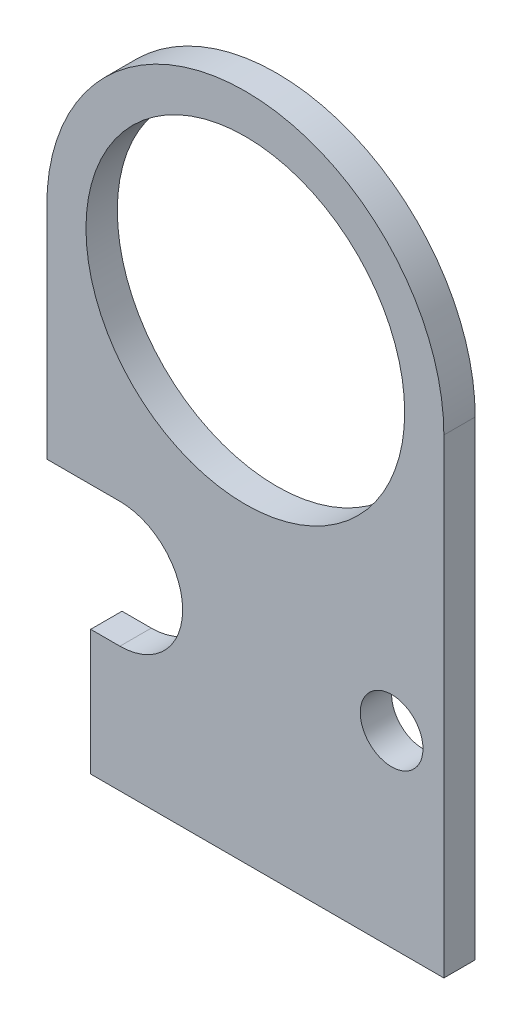
ISO-10303-21;
HEADER;
FILE_DESCRIPTION(('STEP AP214'),'2;1');
FILE_NAME('part.step','',(''),(''),'','','');
FILE_SCHEMA(('AUTOMOTIVE_DESIGN { 1 0 10303 214 1 1 1 1 }'));
ENDSEC;
DATA;
#1=APPLICATION_CONTEXT('core data for automotive mechanical design processes');
#2=APPLICATION_PROTOCOL_DEFINITION('international standard','automotive_design',2000,#1);
#3=PRODUCT_CONTEXT('',#1,'mechanical');
#4=PRODUCT('Part','Part','',(#3));
#5=PRODUCT_RELATED_PRODUCT_CATEGORY('part','',(#4));
#6=PRODUCT_DEFINITION_FORMATION('','',#4);
#7=PRODUCT_DEFINITION_CONTEXT('part definition',#1,'design');
#8=PRODUCT_DEFINITION('design','',#6,#7);
#9=PRODUCT_DEFINITION_SHAPE('','',#8);
#10=(LENGTH_UNIT() NAMED_UNIT(*) SI_UNIT(.MILLI.,.METRE.));
#11=(NAMED_UNIT(*) PLANE_ANGLE_UNIT() SI_UNIT($,.RADIAN.));
#12=(NAMED_UNIT(*) SI_UNIT($,.STERADIAN.) SOLID_ANGLE_UNIT());
#13=UNCERTAINTY_MEASURE_WITH_UNIT(LENGTH_MEASURE(1.E-05),#10,'distance_accuracy_value','');
#14=(GEOMETRIC_REPRESENTATION_CONTEXT(3) GLOBAL_UNCERTAINTY_ASSIGNED_CONTEXT((#13)) GLOBAL_UNIT_ASSIGNED_CONTEXT((#10,
#11,#12)) REPRESENTATION_CONTEXT('',''));
#15=CARTESIAN_POINT('',(0.,0.,0.));
#16=DIRECTION('',(0.,0.,1.));
#17=DIRECTION('',(1.,0.,0.));
#18=AXIS2_PLACEMENT_3D('',#15,#16,#17);
#19=CARTESIAN_POINT('',(0.,0.,3.));
#20=DIRECTION('',(0.,0.,1.));
#21=DIRECTION('',(1.,0.,0.));
#22=AXIS2_PLACEMENT_3D('',#19,#20,#21);
#23=PLANE('',#22);
#24=DIRECTION('',(1.,0.,0.));
#25=VECTOR('',#24,1.);
#26=CARTESIAN_POINT('',(-12.,-33.,3.));
#27=LINE('',#26,#25);
#28=CARTESIAN_POINT('',(-14.8,-33.,3.));
#29=VERTEX_POINT('',#28);
#30=CARTESIAN_POINT('',(-12.,-33.,3.));
#31=VERTEX_POINT('',#30);
#32=EDGE_CURVE('E127',#29,#31,#27,.T.);
#33=ORIENTED_EDGE('',*,*,#32,.F.);
#34=DIRECTION('',(0.,-1.,0.));
#35=VECTOR('',#34,1.);
#36=CARTESIAN_POINT('',(-14.8,-32.,3.));
#37=LINE('',#36,#35);
#38=CARTESIAN_POINT('',(-14.8,-45.,3.));
#39=VERTEX_POINT('',#38);
#40=EDGE_CURVE('E157',#29,#39,#37,.T.);
#41=ORIENTED_EDGE('',*,*,#40,.T.);
#42=DIRECTION('',(1.,0.,0.));
#43=VECTOR('',#42,1.);
#44=CARTESIAN_POINT('',(-14.8,-45.,3.));
#45=LINE('',#44,#43);
#46=CARTESIAN_POINT('',(19.,-45.,3.));
#47=VERTEX_POINT('',#46);
#48=EDGE_CURVE('E159',#39,#47,#45,.T.);
#49=ORIENTED_EDGE('',*,*,#48,.T.);
#50=DIRECTION('',(0.,1.,0.));
#51=VECTOR('',#50,1.);
#52=CARTESIAN_POINT('',(19.,-45.,3.));
#53=LINE('',#52,#51);
#54=CARTESIAN_POINT('',(19.,0.,3.));
#55=VERTEX_POINT('',#54);
#56=EDGE_CURVE('E57',#47,#55,#53,.T.);
#57=ORIENTED_EDGE('',*,*,#56,.T.);
#58=CARTESIAN_POINT('',(0.,0.,3.));
#59=DIRECTION('',(0.,0.,1.));
#60=DIRECTION('',(1.,0.,0.));
#61=AXIS2_PLACEMENT_3D('',#58,#59,#60);
#62=CIRCLE('',#61,19.);
#63=CARTESIAN_POINT('',(-19.,0.,3.));
#64=VERTEX_POINT('',#63);
#65=EDGE_CURVE('E154',#55,#64,#62,.T.);
#66=ORIENTED_EDGE('',*,*,#65,.T.);
#67=DIRECTION('',(0.,-1.,0.));
#68=VECTOR('',#67,1.);
#69=CARTESIAN_POINT('',(-19.,0.,3.));
#70=LINE('',#69,#68);
#71=CARTESIAN_POINT('',(-19.,-21.,3.));
#72=VERTEX_POINT('',#71);
#73=EDGE_CURVE('E85',#64,#72,#70,.T.);
#74=ORIENTED_EDGE('',*,*,#73,.T.);
#75=DIRECTION('',(-1.,0.,0.));
#76=VECTOR('',#75,1.);
#77=CARTESIAN_POINT('',(-12.,-21.,3.));
#78=LINE('',#77,#76);
#79=CARTESIAN_POINT('',(-12.,-21.,3.));
#80=VERTEX_POINT('',#79);
#81=EDGE_CURVE('E130',#80,#72,#78,.T.);
#82=ORIENTED_EDGE('',*,*,#81,.F.);
#83=CARTESIAN_POINT('',(-12.,-27.,3.));
#84=DIRECTION('',(0.,0.,1.));
#85=DIRECTION('',(1.,0.,0.));
#86=AXIS2_PLACEMENT_3D('',#83,#84,#85);
#87=CIRCLE('',#86,6.);
#88=EDGE_CURVE('E114',#31,#80,#87,.T.);
#89=ORIENTED_EDGE('',*,*,#88,.F.);
#90=EDGE_LOOP('',(#33,#41,#49,#57,#66,#74,#82,#89));
#91=FACE_BOUND('',#90,.T.);
#92=CARTESIAN_POINT('',(14.,-27.,3.));
#93=DIRECTION('',(0.,0.,1.));
#94=DIRECTION('',(1.,0.,0.));
#95=AXIS2_PLACEMENT_3D('',#92,#93,#94);
#96=CIRCLE('',#95,3.);
#97=CARTESIAN_POINT('',(17.,-27.,3.));
#98=VERTEX_POINT('',#97);
#99=EDGE_CURVE('E138',#98,#98,#96,.T.);
#100=ORIENTED_EDGE('',*,*,#99,.F.);
#101=EDGE_LOOP('',(#100));
#102=FACE_BOUND('',#101,.T.);
#103=CARTESIAN_POINT('',(0.,0.,3.));
#104=DIRECTION('',(0.,0.,1.));
#105=DIRECTION('',(1.,0.,0.));
#106=AXIS2_PLACEMENT_3D('',#103,#104,#105);
#107=CIRCLE('',#106,15.25);
#108=CARTESIAN_POINT('',(15.25,0.,3.));
#109=VERTEX_POINT('',#108);
#110=EDGE_CURVE('E145',#109,#109,#107,.T.);
#111=ORIENTED_EDGE('',*,*,#110,.F.);
#112=EDGE_LOOP('',(#111));
#113=FACE_BOUND('',#112,.T.);
#114=ADVANCED_FACE('F33',(#91,#102,#113),#23,.T.);
#115=CARTESIAN_POINT('',(0.,0.,0.));
#116=DIRECTION('',(0.,0.,1.));
#117=DIRECTION('',(1.,0.,0.));
#118=AXIS2_PLACEMENT_3D('',#115,#116,#117);
#119=PLANE('',#118);
#120=CARTESIAN_POINT('',(14.,-27.,0.));
#121=DIRECTION('',(0.,0.,1.));
#122=DIRECTION('',(1.,0.,0.));
#123=AXIS2_PLACEMENT_3D('',#120,#121,#122);
#124=CIRCLE('',#123,3.);
#125=CARTESIAN_POINT('',(17.,-27.,0.));
#126=VERTEX_POINT('',#125);
#127=EDGE_CURVE('E142',#126,#126,#124,.T.);
#128=ORIENTED_EDGE('',*,*,#127,.T.);
#129=EDGE_LOOP('',(#128));
#130=FACE_BOUND('',#129,.T.);
#131=CARTESIAN_POINT('',(0.,0.,0.));
#132=DIRECTION('',(0.,0.,1.));
#133=DIRECTION('',(1.,0.,0.));
#134=AXIS2_PLACEMENT_3D('',#131,#132,#133);
#135=CIRCLE('',#134,15.25);
#136=CARTESIAN_POINT('',(15.25,0.,0.));
#137=VERTEX_POINT('',#136);
#138=EDGE_CURVE('E148',#137,#137,#135,.T.);
#139=ORIENTED_EDGE('',*,*,#138,.T.);
#140=EDGE_LOOP('',(#139));
#141=FACE_BOUND('',#140,.T.);
#142=DIRECTION('',(0.,-1.,0.));
#143=VECTOR('',#142,1.);
#144=CARTESIAN_POINT('',(-14.8,-32.,0.));
#145=LINE('',#144,#143);
#146=CARTESIAN_POINT('',(-14.8,-33.,0.));
#147=VERTEX_POINT('',#146);
#148=CARTESIAN_POINT('',(-14.8,-45.,0.));
#149=VERTEX_POINT('',#148);
#150=EDGE_CURVE('E167',#147,#149,#145,.T.);
#151=ORIENTED_EDGE('',*,*,#150,.F.);
#152=DIRECTION('',(1.,0.,0.));
#153=VECTOR('',#152,1.);
#154=CARTESIAN_POINT('',(-12.,-33.,0.));
#155=LINE('',#154,#153);
#156=CARTESIAN_POINT('',(-12.,-33.,0.));
#157=VERTEX_POINT('',#156);
#158=EDGE_CURVE('E48',#147,#157,#155,.T.);
#159=ORIENTED_EDGE('',*,*,#158,.T.);
#160=CARTESIAN_POINT('',(-12.,-27.,0.));
#161=DIRECTION('',(0.,0.,1.));
#162=DIRECTION('',(1.,0.,0.));
#163=AXIS2_PLACEMENT_3D('',#160,#161,#162);
#164=CIRCLE('',#163,6.);
#165=CARTESIAN_POINT('',(-12.,-21.,0.));
#166=VERTEX_POINT('',#165);
#167=EDGE_CURVE('E112',#157,#166,#164,.T.);
#168=ORIENTED_EDGE('',*,*,#167,.T.);
#169=DIRECTION('',(-1.,0.,0.));
#170=VECTOR('',#169,1.);
#171=CARTESIAN_POINT('',(-12.,-21.,0.));
#172=LINE('',#171,#170);
#173=CARTESIAN_POINT('',(-19.,-21.,0.));
#174=VERTEX_POINT('',#173);
#175=EDGE_CURVE('E120',#166,#174,#172,.T.);
#176=ORIENTED_EDGE('',*,*,#175,.T.);
#177=DIRECTION('',(0.,-1.,0.));
#178=VECTOR('',#177,1.);
#179=CARTESIAN_POINT('',(-19.,0.,0.));
#180=LINE('',#179,#178);
#181=CARTESIAN_POINT('',(-19.,0.,0.));
#182=VERTEX_POINT('',#181);
#183=EDGE_CURVE('E165',#182,#174,#180,.T.);
#184=ORIENTED_EDGE('',*,*,#183,.F.);
#185=CARTESIAN_POINT('',(0.,0.,0.));
#186=DIRECTION('',(0.,0.,1.));
#187=DIRECTION('',(1.,0.,0.));
#188=AXIS2_PLACEMENT_3D('',#185,#186,#187);
#189=CIRCLE('',#188,19.);
#190=CARTESIAN_POINT('',(19.,0.,0.));
#191=VERTEX_POINT('',#190);
#192=EDGE_CURVE('E151',#191,#182,#189,.T.);
#193=ORIENTED_EDGE('',*,*,#192,.F.);
#194=DIRECTION('',(0.,1.,0.));
#195=VECTOR('',#194,1.);
#196=CARTESIAN_POINT('',(19.,-45.,0.));
#197=LINE('',#196,#195);
#198=CARTESIAN_POINT('',(19.,-45.,0.));
#199=VERTEX_POINT('',#198);
#200=EDGE_CURVE('E78',#199,#191,#197,.T.);
#201=ORIENTED_EDGE('',*,*,#200,.F.);
#202=DIRECTION('',(1.,0.,0.));
#203=VECTOR('',#202,1.);
#204=CARTESIAN_POINT('',(-14.8,-45.,0.));
#205=LINE('',#204,#203);
#206=EDGE_CURVE('E169',#149,#199,#205,.T.);
#207=ORIENTED_EDGE('',*,*,#206,.F.);
#208=EDGE_LOOP('',(#151,#159,#168,#176,#184,#193,#201,#207));
#209=FACE_BOUND('',#208,.T.);
#210=ADVANCED_FACE('F126',(#130,#141,#209),#119,.F.);
#211=CARTESIAN_POINT('',(0.,0.,3.));
#212=DIRECTION('',(0.,0.,-1.));
#213=DIRECTION('',(-1.,0.,0.));
#214=AXIS2_PLACEMENT_3D('',#211,#212,#213);
#215=CYLINDRICAL_SURFACE('',#214,19.);
#216=ORIENTED_EDGE('',*,*,#192,.T.);
#217=DIRECTION('',(0.,0.,-1.));
#218=VECTOR('',#217,1.);
#219=CARTESIAN_POINT('',(-19.,0.,3.));
#220=LINE('',#219,#218);
#221=EDGE_CURVE('E11',#64,#182,#220,.T.);
#222=ORIENTED_EDGE('',*,*,#221,.F.);
#223=ORIENTED_EDGE('',*,*,#65,.F.);
#224=DIRECTION('',(0.,0.,-1.));
#225=VECTOR('',#224,1.);
#226=CARTESIAN_POINT('',(19.,0.,3.));
#227=LINE('',#226,#225);
#228=EDGE_CURVE('E162',#55,#191,#227,.T.);
#229=ORIENTED_EDGE('',*,*,#228,.T.);
#230=EDGE_LOOP('',(#216,#222,#223,#229));
#231=FACE_BOUND('',#230,.T.);
#232=ADVANCED_FACE('F35',(#231),#215,.T.);
#233=CARTESIAN_POINT('',(-19.,0.,3.));
#234=DIRECTION('',(1.,0.,0.));
#235=DIRECTION('',(0.,1.,0.));
#236=AXIS2_PLACEMENT_3D('',#233,#234,#235);
#237=PLANE('',#236);
#238=ORIENTED_EDGE('',*,*,#183,.T.);
#239=DIRECTION('',(0.,0.,1.));
#240=VECTOR('',#239,1.);
#241=CARTESIAN_POINT('',(-19.,-21.,0.));
#242=LINE('',#241,#240);
#243=EDGE_CURVE('E117',#174,#72,#242,.T.);
#244=ORIENTED_EDGE('',*,*,#243,.T.);
#245=ORIENTED_EDGE('',*,*,#73,.F.);
#246=ORIENTED_EDGE('',*,*,#221,.T.);
#247=EDGE_LOOP('',(#238,#244,#245,#246));
#248=FACE_BOUND('',#247,.T.);
#249=ADVANCED_FACE('F221',(#248),#237,.F.);
#250=CARTESIAN_POINT('',(-14.8,-32.,3.));
#251=DIRECTION('',(1.,0.,0.));
#252=DIRECTION('',(0.,0.,-1.));
#253=AXIS2_PLACEMENT_3D('',#250,#251,#252);
#254=PLANE('',#253);
#255=ORIENTED_EDGE('',*,*,#40,.F.);
#256=DIRECTION('',(0.,0.,1.));
#257=VECTOR('',#256,1.);
#258=CARTESIAN_POINT('',(-14.8,-33.,0.));
#259=LINE('',#258,#257);
#260=EDGE_CURVE('E139',#147,#29,#259,.T.);
#261=ORIENTED_EDGE('',*,*,#260,.F.);
#262=ORIENTED_EDGE('',*,*,#150,.T.);
#263=DIRECTION('',(0.,0.,-1.));
#264=VECTOR('',#263,1.);
#265=CARTESIAN_POINT('',(-14.8,-45.,3.));
#266=LINE('',#265,#264);
#267=EDGE_CURVE('E41',#39,#149,#266,.T.);
#268=ORIENTED_EDGE('',*,*,#267,.F.);
#269=EDGE_LOOP('',(#255,#261,#262,#268));
#270=FACE_BOUND('',#269,.T.);
#271=ADVANCED_FACE('F198',(#270),#254,.F.);
#272=CARTESIAN_POINT('',(-14.8,-45.,3.));
#273=DIRECTION('',(0.,1.,0.));
#274=DIRECTION('',(-1.,0.,0.));
#275=AXIS2_PLACEMENT_3D('',#272,#273,#274);
#276=PLANE('',#275);
#277=ORIENTED_EDGE('',*,*,#206,.T.);
#278=DIRECTION('',(0.,0.,-1.));
#279=VECTOR('',#278,1.);
#280=CARTESIAN_POINT('',(19.,-45.,3.));
#281=LINE('',#280,#279);
#282=EDGE_CURVE('E173',#47,#199,#281,.T.);
#283=ORIENTED_EDGE('',*,*,#282,.F.);
#284=ORIENTED_EDGE('',*,*,#48,.F.);
#285=ORIENTED_EDGE('',*,*,#267,.T.);
#286=EDGE_LOOP('',(#277,#283,#284,#285));
#287=FACE_BOUND('',#286,.T.);
#288=ADVANCED_FACE('F179',(#287),#276,.F.);
#289=CARTESIAN_POINT('',(19.,-45.,3.));
#290=DIRECTION('',(-1.,0.,0.));
#291=DIRECTION('',(0.,0.,1.));
#292=AXIS2_PLACEMENT_3D('',#289,#290,#291);
#293=PLANE('',#292);
#294=ORIENTED_EDGE('',*,*,#200,.T.);
#295=ORIENTED_EDGE('',*,*,#228,.F.);
#296=ORIENTED_EDGE('',*,*,#56,.F.);
#297=ORIENTED_EDGE('',*,*,#282,.T.);
#298=EDGE_LOOP('',(#294,#295,#296,#297));
#299=FACE_BOUND('',#298,.T.);
#300=ADVANCED_FACE('F187',(#299),#293,.F.);
#301=CARTESIAN_POINT('',(0.,0.,0.));
#302=DIRECTION('',(0.,0.,1.));
#303=DIRECTION('',(1.,0.,0.));
#304=AXIS2_PLACEMENT_3D('',#301,#302,#303);
#305=CYLINDRICAL_SURFACE('',#304,15.25);
#306=ORIENTED_EDGE('',*,*,#138,.F.);
#307=EDGE_LOOP('',(#306));
#308=FACE_BOUND('',#307,.T.);
#309=ORIENTED_EDGE('',*,*,#110,.T.);
#310=EDGE_LOOP('',(#309));
#311=FACE_BOUND('',#310,.T.);
#312=ADVANCED_FACE('F189',(#308,#311),#305,.F.);
#313=CARTESIAN_POINT('',(14.,-27.,0.));
#314=DIRECTION('',(0.,0.,1.));
#315=DIRECTION('',(1.,0.,0.));
#316=AXIS2_PLACEMENT_3D('',#313,#314,#315);
#317=CYLINDRICAL_SURFACE('',#316,3.);
#318=ORIENTED_EDGE('',*,*,#127,.F.);
#319=EDGE_LOOP('',(#318));
#320=FACE_BOUND('',#319,.T.);
#321=ORIENTED_EDGE('',*,*,#99,.T.);
#322=EDGE_LOOP('',(#321));
#323=FACE_BOUND('',#322,.T.);
#324=ADVANCED_FACE('F195',(#320,#323),#317,.F.);
#325=CARTESIAN_POINT('',(-12.,-27.,0.));
#326=DIRECTION('',(0.,0.,1.));
#327=DIRECTION('',(1.,0.,0.));
#328=AXIS2_PLACEMENT_3D('',#325,#326,#327);
#329=CYLINDRICAL_SURFACE('',#328,6.);
#330=ORIENTED_EDGE('',*,*,#88,.T.);
#331=DIRECTION('',(0.,0.,1.));
#332=VECTOR('',#331,1.);
#333=CARTESIAN_POINT('',(-12.,-21.,0.));
#334=LINE('',#333,#332);
#335=EDGE_CURVE('E108',#166,#80,#334,.T.);
#336=ORIENTED_EDGE('',*,*,#335,.F.);
#337=ORIENTED_EDGE('',*,*,#167,.F.);
#338=DIRECTION('',(0.,0.,1.));
#339=VECTOR('',#338,1.);
#340=CARTESIAN_POINT('',(-12.,-33.,0.));
#341=LINE('',#340,#339);
#342=EDGE_CURVE('E136',#157,#31,#341,.T.);
#343=ORIENTED_EDGE('',*,*,#342,.T.);
#344=EDGE_LOOP('',(#330,#336,#337,#343));
#345=FACE_BOUND('',#344,.T.);
#346=ADVANCED_FACE('F110',(#345),#329,.F.);
#347=CARTESIAN_POINT('',(-12.,-33.,0.));
#348=DIRECTION('',(0.,-1.,0.));
#349=DIRECTION('',(0.,0.,-1.));
#350=AXIS2_PLACEMENT_3D('',#347,#348,#349);
#351=PLANE('',#350);
#352=ORIENTED_EDGE('',*,*,#32,.T.);
#353=ORIENTED_EDGE('',*,*,#342,.F.);
#354=ORIENTED_EDGE('',*,*,#158,.F.);
#355=ORIENTED_EDGE('',*,*,#260,.T.);
#356=EDGE_LOOP('',(#352,#353,#354,#355));
#357=FACE_BOUND('',#356,.T.);
#358=ADVANCED_FACE('F215',(#357),#351,.F.);
#359=CARTESIAN_POINT('',(-12.,-21.,0.));
#360=DIRECTION('',(0.,1.,0.));
#361=DIRECTION('',(0.,0.,1.));
#362=AXIS2_PLACEMENT_3D('',#359,#360,#361);
#363=PLANE('',#362);
#364=ORIENTED_EDGE('',*,*,#81,.T.);
#365=ORIENTED_EDGE('',*,*,#243,.F.);
#366=ORIENTED_EDGE('',*,*,#175,.F.);
#367=ORIENTED_EDGE('',*,*,#335,.T.);
#368=EDGE_LOOP('',(#364,#365,#366,#367));
#369=FACE_BOUND('',#368,.T.);
#370=ADVANCED_FACE('F121',(#369),#363,.F.);
#371=CLOSED_SHELL('',(#114,#210,#232,#249,#271,#288,#300,#312,#324,#346,#358,#370));
#372=MANIFOLD_SOLID_BREP('B2',#371);
#373=ADVANCED_BREP_SHAPE_REPRESENTATION('',(#18,#372),#14);
#374=SHAPE_DEFINITION_REPRESENTATION(#9,#373);
ENDSEC;
END-ISO-10303-21;
